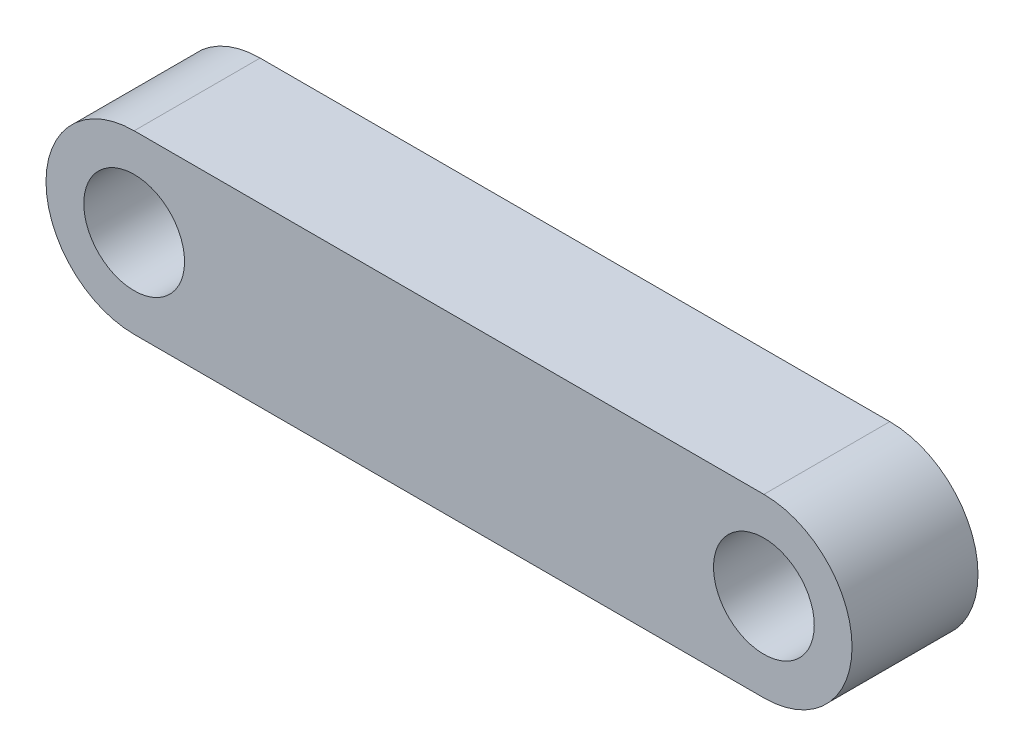
ISO-10303-21;
HEADER;
FILE_DESCRIPTION(('STEP AP214'),'2;1');
FILE_NAME('part.step','',(''),(''),'','','');
FILE_SCHEMA(('AUTOMOTIVE_DESIGN { 1 0 10303 214 1 1 1 1 }'));
ENDSEC;
DATA;
#1=APPLICATION_CONTEXT('core data for automotive mechanical design processes');
#2=APPLICATION_PROTOCOL_DEFINITION('international standard','automotive_design',2000,#1);
#3=PRODUCT_CONTEXT('',#1,'mechanical');
#4=PRODUCT('Part','Part','',(#3));
#5=PRODUCT_RELATED_PRODUCT_CATEGORY('part','',(#4));
#6=PRODUCT_DEFINITION_FORMATION('','',#4);
#7=PRODUCT_DEFINITION_CONTEXT('part definition',#1,'design');
#8=PRODUCT_DEFINITION('design','',#6,#7);
#9=PRODUCT_DEFINITION_SHAPE('','',#8);
#10=(LENGTH_UNIT() NAMED_UNIT(*) SI_UNIT(.MILLI.,.METRE.));
#11=(NAMED_UNIT(*) PLANE_ANGLE_UNIT() SI_UNIT($,.RADIAN.));
#12=(NAMED_UNIT(*) SI_UNIT($,.STERADIAN.) SOLID_ANGLE_UNIT());
#13=UNCERTAINTY_MEASURE_WITH_UNIT(LENGTH_MEASURE(1.E-05),#10,'distance_accuracy_value','');
#14=(GEOMETRIC_REPRESENTATION_CONTEXT(3) GLOBAL_UNCERTAINTY_ASSIGNED_CONTEXT((#13)) GLOBAL_UNIT_ASSIGNED_CONTEXT((#10,
#11,#12)) REPRESENTATION_CONTEXT('',''));
#15=CARTESIAN_POINT('',(0.,0.,0.));
#16=DIRECTION('',(0.,0.,1.));
#17=DIRECTION('',(1.,0.,0.));
#18=AXIS2_PLACEMENT_3D('',#15,#16,#17);
#19=CARTESIAN_POINT('',(12.5,0.,5.));
#20=DIRECTION('',(0.,0.,-1.));
#21=DIRECTION('',(-1.,0.,0.));
#22=AXIS2_PLACEMENT_3D('',#19,#20,#21);
#23=CYLINDRICAL_SURFACE('',#22,2.);
#24=CARTESIAN_POINT('',(12.5,0.,5.));
#25=DIRECTION('',(0.,0.,1.));
#26=DIRECTION('',(1.,0.,0.));
#27=AXIS2_PLACEMENT_3D('',#24,#25,#26);
#28=CIRCLE('',#27,2.);
#29=CARTESIAN_POINT('',(14.5,0.,5.));
#30=VERTEX_POINT('',#29);
#31=EDGE_CURVE('E140',#30,#30,#28,.T.);
#32=ORIENTED_EDGE('',*,*,#31,.T.);
#33=EDGE_LOOP('',(#32));
#34=FACE_BOUND('',#33,.T.);
#35=CARTESIAN_POINT('',(12.5,0.,0.));
#36=DIRECTION('',(0.,0.,1.));
#37=DIRECTION('',(1.,0.,0.));
#38=AXIS2_PLACEMENT_3D('',#35,#36,#37);
#39=CIRCLE('',#38,2.);
#40=CARTESIAN_POINT('',(14.5,0.,0.));
#41=VERTEX_POINT('',#40);
#42=EDGE_CURVE('E142',#41,#41,#39,.T.);
#43=ORIENTED_EDGE('',*,*,#42,.F.);
#44=EDGE_LOOP('',(#43));
#45=FACE_BOUND('',#44,.T.);
#46=ADVANCED_FACE('F74',(#34,#45),#23,.F.);
#47=CARTESIAN_POINT('',(0.,3.5,5.));
#48=DIRECTION('',(0.,1.,0.));
#49=DIRECTION('',(-1.,0.,0.));
#50=AXIS2_PLACEMENT_3D('',#47,#48,#49);
#51=PLANE('',#50);
#52=DIRECTION('',(1.,0.,0.));
#53=VECTOR('',#52,1.);
#54=CARTESIAN_POINT('',(0.,3.5,0.));
#55=LINE('',#54,#53);
#56=CARTESIAN_POINT('',(-12.5,3.5,0.));
#57=VERTEX_POINT('',#56);
#58=CARTESIAN_POINT('',(12.5,3.5,0.));
#59=VERTEX_POINT('',#58);
#60=EDGE_CURVE('E127',#57,#59,#55,.T.);
#61=ORIENTED_EDGE('',*,*,#60,.F.);
#62=DIRECTION('',(0.,0.,-1.));
#63=VECTOR('',#62,1.);
#64=CARTESIAN_POINT('',(-12.5,3.5,5.));
#65=LINE('',#64,#63);
#66=CARTESIAN_POINT('',(-12.5,3.5,5.));
#67=VERTEX_POINT('',#66);
#68=EDGE_CURVE('E84',#67,#57,#65,.T.);
#69=ORIENTED_EDGE('',*,*,#68,.F.);
#70=DIRECTION('',(1.,0.,0.));
#71=VECTOR('',#70,1.);
#72=CARTESIAN_POINT('',(0.,3.5,5.));
#73=LINE('',#72,#71);
#74=CARTESIAN_POINT('',(12.5,3.5,5.));
#75=VERTEX_POINT('',#74);
#76=EDGE_CURVE('E125',#67,#75,#73,.T.);
#77=ORIENTED_EDGE('',*,*,#76,.T.);
#78=DIRECTION('',(0.,0.,-1.));
#79=VECTOR('',#78,1.);
#80=CARTESIAN_POINT('',(12.5,3.5,5.));
#81=LINE('',#80,#79);
#82=EDGE_CURVE('E13',#75,#59,#81,.T.);
#83=ORIENTED_EDGE('',*,*,#82,.T.);
#84=EDGE_LOOP('',(#61,#69,#77,#83));
#85=FACE_BOUND('',#84,.T.);
#86=ADVANCED_FACE('F124',(#85),#51,.T.);
#87=CARTESIAN_POINT('',(0.,-3.5,5.));
#88=DIRECTION('',(0.,1.,0.));
#89=DIRECTION('',(-1.,0.,0.));
#90=AXIS2_PLACEMENT_3D('',#87,#88,#89);
#91=PLANE('',#90);
#92=DIRECTION('',(1.,0.,0.));
#93=VECTOR('',#92,1.);
#94=CARTESIAN_POINT('',(0.,-3.5,0.));
#95=LINE('',#94,#93);
#96=CARTESIAN_POINT('',(-12.5,-3.5,0.));
#97=VERTEX_POINT('',#96);
#98=CARTESIAN_POINT('',(12.5,-3.5,0.));
#99=VERTEX_POINT('',#98);
#100=EDGE_CURVE('E112',#97,#99,#95,.T.);
#101=ORIENTED_EDGE('',*,*,#100,.T.);
#102=DIRECTION('',(0.,0.,-1.));
#103=VECTOR('',#102,1.);
#104=CARTESIAN_POINT('',(12.5,-3.5,5.));
#105=LINE('',#104,#103);
#106=CARTESIAN_POINT('',(12.5,-3.5,5.));
#107=VERTEX_POINT('',#106);
#108=EDGE_CURVE('E162',#107,#99,#105,.T.);
#109=ORIENTED_EDGE('',*,*,#108,.F.);
#110=DIRECTION('',(1.,0.,0.));
#111=VECTOR('',#110,1.);
#112=CARTESIAN_POINT('',(0.,-3.5,5.));
#113=LINE('',#112,#111);
#114=CARTESIAN_POINT('',(-12.5,-3.5,5.));
#115=VERTEX_POINT('',#114);
#116=EDGE_CURVE('E93',#115,#107,#113,.T.);
#117=ORIENTED_EDGE('',*,*,#116,.F.);
#118=DIRECTION('',(0.,0.,-1.));
#119=VECTOR('',#118,1.);
#120=CARTESIAN_POINT('',(-12.5,-3.5,5.));
#121=LINE('',#120,#119);
#122=EDGE_CURVE('E108',#115,#97,#121,.T.);
#123=ORIENTED_EDGE('',*,*,#122,.T.);
#124=EDGE_LOOP('',(#101,#109,#117,#123));
#125=FACE_BOUND('',#124,.T.);
#126=ADVANCED_FACE('F193',(#125),#91,.F.);
#127=CARTESIAN_POINT('',(12.5,0.,5.));
#128=DIRECTION('',(0.,0.,-1.));
#129=DIRECTION('',(-1.,0.,0.));
#130=AXIS2_PLACEMENT_3D('',#127,#128,#129);
#131=CYLINDRICAL_SURFACE('',#130,3.5);
#132=CARTESIAN_POINT('',(12.5,0.,0.));
#133=DIRECTION('',(0.,0.,1.));
#134=DIRECTION('',(1.,0.,0.));
#135=AXIS2_PLACEMENT_3D('',#132,#133,#134);
#136=CIRCLE('',#135,3.5);
#137=EDGE_CURVE('E133',#99,#59,#136,.T.);
#138=ORIENTED_EDGE('',*,*,#137,.T.);
#139=ORIENTED_EDGE('',*,*,#82,.F.);
#140=CARTESIAN_POINT('',(12.5,0.,5.));
#141=DIRECTION('',(0.,0.,1.));
#142=DIRECTION('',(1.,0.,0.));
#143=AXIS2_PLACEMENT_3D('',#140,#141,#142);
#144=CIRCLE('',#143,3.5);
#145=EDGE_CURVE('E117',#107,#75,#144,.T.);
#146=ORIENTED_EDGE('',*,*,#145,.F.);
#147=ORIENTED_EDGE('',*,*,#108,.T.);
#148=EDGE_LOOP('',(#138,#139,#146,#147));
#149=FACE_BOUND('',#148,.T.);
#150=ADVANCED_FACE('F187',(#149),#131,.T.);
#151=CARTESIAN_POINT('',(0.,0.,0.));
#152=DIRECTION('',(0.,0.,1.));
#153=DIRECTION('',(1.,0.,0.));
#154=AXIS2_PLACEMENT_3D('',#151,#152,#153);
#155=PLANE('',#154);
#156=ORIENTED_EDGE('',*,*,#137,.F.);
#157=ORIENTED_EDGE('',*,*,#100,.F.);
#158=CARTESIAN_POINT('',(-12.5,0.,0.));
#159=DIRECTION('',(0.,0.,1.));
#160=DIRECTION('',(1.,0.,0.));
#161=AXIS2_PLACEMENT_3D('',#158,#159,#160);
#162=CIRCLE('',#161,3.5);
#163=EDGE_CURVE('E78',#57,#97,#162,.T.);
#164=ORIENTED_EDGE('',*,*,#163,.F.);
#165=ORIENTED_EDGE('',*,*,#60,.T.);
#166=EDGE_LOOP('',(#156,#157,#164,#165));
#167=FACE_BOUND('',#166,.T.);
#168=ORIENTED_EDGE('',*,*,#42,.T.);
#169=EDGE_LOOP('',(#168));
#170=FACE_BOUND('',#169,.T.);
#171=CARTESIAN_POINT('',(-12.5,0.,0.));
#172=DIRECTION('',(0.,0.,1.));
#173=DIRECTION('',(1.,0.,0.));
#174=AXIS2_PLACEMENT_3D('',#171,#172,#173);
#175=CIRCLE('',#174,2.);
#176=CARTESIAN_POINT('',(-10.5,0.,0.));
#177=VERTEX_POINT('',#176);
#178=EDGE_CURVE('E154',#177,#177,#175,.T.);
#179=ORIENTED_EDGE('',*,*,#178,.T.);
#180=EDGE_LOOP('',(#179));
#181=FACE_BOUND('',#180,.T.);
#182=ADVANCED_FACE('F178',(#167,#170,#181),#155,.F.);
#183=CARTESIAN_POINT('',(0.,0.,5.));
#184=DIRECTION('',(0.,0.,1.));
#185=DIRECTION('',(1.,0.,0.));
#186=AXIS2_PLACEMENT_3D('',#183,#184,#185);
#187=PLANE('',#186);
#188=ORIENTED_EDGE('',*,*,#145,.T.);
#189=ORIENTED_EDGE('',*,*,#76,.F.);
#190=CARTESIAN_POINT('',(-12.5,0.,5.));
#191=DIRECTION('',(0.,0.,1.));
#192=DIRECTION('',(1.,0.,0.));
#193=AXIS2_PLACEMENT_3D('',#190,#191,#192);
#194=CIRCLE('',#193,3.5);
#195=EDGE_CURVE('E131',#67,#115,#194,.T.);
#196=ORIENTED_EDGE('',*,*,#195,.T.);
#197=ORIENTED_EDGE('',*,*,#116,.T.);
#198=EDGE_LOOP('',(#188,#189,#196,#197));
#199=FACE_BOUND('',#198,.T.);
#200=ORIENTED_EDGE('',*,*,#31,.F.);
#201=EDGE_LOOP('',(#200));
#202=FACE_BOUND('',#201,.T.);
#203=CARTESIAN_POINT('',(-12.5,0.,5.));
#204=DIRECTION('',(0.,0.,1.));
#205=DIRECTION('',(1.,0.,0.));
#206=AXIS2_PLACEMENT_3D('',#203,#204,#205);
#207=CIRCLE('',#206,2.);
#208=CARTESIAN_POINT('',(-10.5,0.,5.));
#209=VERTEX_POINT('',#208);
#210=EDGE_CURVE('E156',#209,#209,#207,.T.);
#211=ORIENTED_EDGE('',*,*,#210,.F.);
#212=EDGE_LOOP('',(#211));
#213=FACE_BOUND('',#212,.T.);
#214=ADVANCED_FACE('F134',(#199,#202,#213),#187,.T.);
#215=CARTESIAN_POINT('',(-12.5,0.,5.));
#216=DIRECTION('',(0.,0.,-1.));
#217=DIRECTION('',(-1.,0.,0.));
#218=AXIS2_PLACEMENT_3D('',#215,#216,#217);
#219=CYLINDRICAL_SURFACE('',#218,2.);
#220=ORIENTED_EDGE('',*,*,#210,.T.);
#221=EDGE_LOOP('',(#220));
#222=FACE_BOUND('',#221,.T.);
#223=ORIENTED_EDGE('',*,*,#178,.F.);
#224=EDGE_LOOP('',(#223));
#225=FACE_BOUND('',#224,.T.);
#226=ADVANCED_FACE('F177',(#222,#225),#219,.F.);
#227=CARTESIAN_POINT('',(-12.5,0.,5.));
#228=DIRECTION('',(0.,0.,-1.));
#229=DIRECTION('',(-1.,0.,0.));
#230=AXIS2_PLACEMENT_3D('',#227,#228,#229);
#231=CYLINDRICAL_SURFACE('',#230,3.5);
#232=ORIENTED_EDGE('',*,*,#68,.T.);
#233=ORIENTED_EDGE('',*,*,#163,.T.);
#234=ORIENTED_EDGE('',*,*,#122,.F.);
#235=ORIENTED_EDGE('',*,*,#195,.F.);
#236=EDGE_LOOP('',(#232,#233,#234,#235));
#237=FACE_BOUND('',#236,.T.);
#238=ADVANCED_FACE('F76',(#237),#231,.T.);
#239=CLOSED_SHELL('',(#46,#86,#126,#150,#182,#214,#226,#238));
#240=MANIFOLD_SOLID_BREP('B2',#239);
#241=ADVANCED_BREP_SHAPE_REPRESENTATION('',(#18,#240),#14);
#242=SHAPE_DEFINITION_REPRESENTATION(#9,#241);
ENDSEC;
END-ISO-10303-21;
